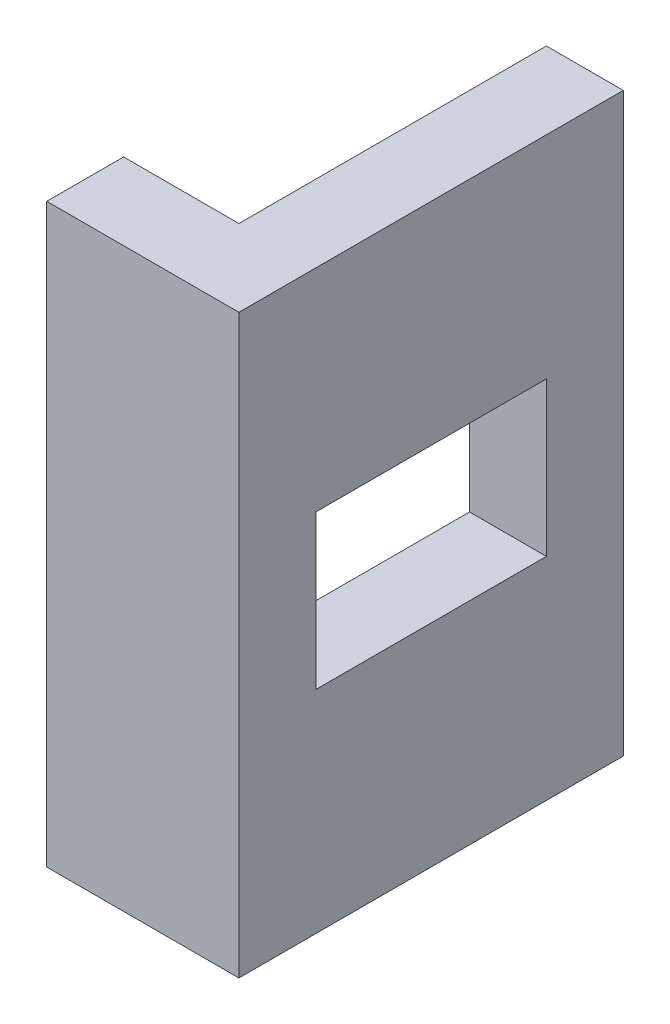
ISO-10303-21;
HEADER;
FILE_DESCRIPTION(('STEP AP214'),'2;1');
FILE_NAME('part.step','',(''),(''),'','','');
FILE_SCHEMA(('AUTOMOTIVE_DESIGN { 1 0 10303 214 1 1 1 1 }'));
ENDSEC;
DATA;
#1=APPLICATION_CONTEXT('core data for automotive mechanical design processes');
#2=APPLICATION_PROTOCOL_DEFINITION('international standard','automotive_design',2000,#1);
#3=PRODUCT_CONTEXT('',#1,'mechanical');
#4=PRODUCT('Part','Part','',(#3));
#5=PRODUCT_RELATED_PRODUCT_CATEGORY('part','',(#4));
#6=PRODUCT_DEFINITION_FORMATION('','',#4);
#7=PRODUCT_DEFINITION_CONTEXT('part definition',#1,'design');
#8=PRODUCT_DEFINITION('design','',#6,#7);
#9=PRODUCT_DEFINITION_SHAPE('','',#8);
#10=(LENGTH_UNIT() NAMED_UNIT(*) SI_UNIT(.MILLI.,.METRE.));
#11=(NAMED_UNIT(*) PLANE_ANGLE_UNIT() SI_UNIT($,.RADIAN.));
#12=(NAMED_UNIT(*) SI_UNIT($,.STERADIAN.) SOLID_ANGLE_UNIT());
#13=UNCERTAINTY_MEASURE_WITH_UNIT(LENGTH_MEASURE(1.E-05),#10,'distance_accuracy_value','');
#14=(GEOMETRIC_REPRESENTATION_CONTEXT(3) GLOBAL_UNCERTAINTY_ASSIGNED_CONTEXT((#13)) GLOBAL_UNIT_ASSIGNED_CONTEXT((#10,
#11,#12)) REPRESENTATION_CONTEXT('',''));
#15=CARTESIAN_POINT('',(0.,0.,0.));
#16=DIRECTION('',(0.,0.,1.));
#17=DIRECTION('',(1.,0.,0.));
#18=AXIS2_PLACEMENT_3D('',#15,#16,#17);
#19=CARTESIAN_POINT('',(2.5,-7.5,5.));
#20=DIRECTION('',(-1.,0.,0.));
#21=DIRECTION('',(0.,0.,1.));
#22=AXIS2_PLACEMENT_3D('',#19,#20,#21);
#23=PLANE('',#22);
#24=DIRECTION('',(0.,1.,0.));
#25=VECTOR('',#24,1.);
#26=CARTESIAN_POINT('',(2.5,-7.5,-5.));
#27=LINE('',#26,#25);
#28=CARTESIAN_POINT('',(2.5,-7.5,-5.));
#29=VERTEX_POINT('',#28);
#30=CARTESIAN_POINT('',(2.5,7.5,-5.));
#31=VERTEX_POINT('',#30);
#32=EDGE_CURVE('E144',#29,#31,#27,.T.);
#33=ORIENTED_EDGE('',*,*,#32,.T.);
#34=DIRECTION('',(0.,0.,-1.));
#35=VECTOR('',#34,1.);
#36=CARTESIAN_POINT('',(2.5,7.5,5.));
#37=LINE('',#36,#35);
#38=CARTESIAN_POINT('',(2.5,7.5,5.));
#39=VERTEX_POINT('',#38);
#40=EDGE_CURVE('E11',#39,#31,#37,.T.);
#41=ORIENTED_EDGE('',*,*,#40,.F.);
#42=DIRECTION('',(0.,1.,0.));
#43=VECTOR('',#42,1.);
#44=CARTESIAN_POINT('',(2.5,-7.5,5.));
#45=LINE('',#44,#43);
#46=CARTESIAN_POINT('',(2.5,-7.5,5.));
#47=VERTEX_POINT('',#46);
#48=EDGE_CURVE('E146',#47,#39,#45,.T.);
#49=ORIENTED_EDGE('',*,*,#48,.F.);
#50=DIRECTION('',(0.,0.,-1.));
#51=VECTOR('',#50,1.);
#52=CARTESIAN_POINT('',(2.5,-7.5,5.));
#53=LINE('',#52,#51);
#54=EDGE_CURVE('E156',#47,#29,#53,.T.);
#55=ORIENTED_EDGE('',*,*,#54,.T.);
#56=EDGE_LOOP('',(#33,#41,#49,#55));
#57=FACE_BOUND('',#56,.T.);
#58=DIRECTION('',(0.,-1.,0.));
#59=VECTOR('',#58,1.);
#60=CARTESIAN_POINT('',(2.5,-2.,-3.));
#61=LINE('',#60,#59);
#62=CARTESIAN_POINT('',(2.5,2.,-3.));
#63=VERTEX_POINT('',#62);
#64=CARTESIAN_POINT('',(2.5,-2.,-3.));
#65=VERTEX_POINT('',#64);
#66=EDGE_CURVE('E118',#63,#65,#61,.T.);
#67=ORIENTED_EDGE('',*,*,#66,.T.);
#68=DIRECTION('',(0.,0.,-1.));
#69=VECTOR('',#68,1.);
#70=CARTESIAN_POINT('',(2.5,-2.,-3.));
#71=LINE('',#70,#69);
#72=CARTESIAN_POINT('',(2.5,-2.,3.));
#73=VERTEX_POINT('',#72);
#74=EDGE_CURVE('E182',#73,#65,#71,.T.);
#75=ORIENTED_EDGE('',*,*,#74,.F.);
#76=DIRECTION('',(0.,-1.,0.));
#77=VECTOR('',#76,1.);
#78=CARTESIAN_POINT('',(2.5,-2.,3.));
#79=LINE('',#78,#77);
#80=CARTESIAN_POINT('',(2.5,2.,3.));
#81=VERTEX_POINT('',#80);
#82=EDGE_CURVE('E177',#81,#73,#79,.T.);
#83=ORIENTED_EDGE('',*,*,#82,.F.);
#84=DIRECTION('',(0.,0.,-1.));
#85=VECTOR('',#84,1.);
#86=CARTESIAN_POINT('',(2.5,2.,-3.));
#87=LINE('',#86,#85);
#88=EDGE_CURVE('E114',#81,#63,#87,.T.);
#89=ORIENTED_EDGE('',*,*,#88,.T.);
#90=EDGE_LOOP('',(#67,#75,#83,#89));
#91=FACE_BOUND('',#90,.T.);
#92=ADVANCED_FACE('F33',(#57,#91),#23,.F.);
#93=CARTESIAN_POINT('',(-2.5,7.5,5.));
#94=DIRECTION('',(0.,-1.,0.));
#95=DIRECTION('',(0.,0.,-1.));
#96=AXIS2_PLACEMENT_3D('',#93,#94,#95);
#97=PLANE('',#96);
#98=DIRECTION('',(-1.,0.,0.));
#99=VECTOR('',#98,1.);
#100=CARTESIAN_POINT('',(-2.5,7.5,-5.));
#101=LINE('',#100,#99);
#102=CARTESIAN_POINT('',(0.500000000000002,7.5,-5.));
#103=VERTEX_POINT('',#102);
#104=EDGE_CURVE('E159',#31,#103,#101,.T.);
#105=ORIENTED_EDGE('',*,*,#104,.T.);
#106=DIRECTION('',(0.,0.,-1.));
#107=VECTOR('',#106,1.);
#108=CARTESIAN_POINT('',(0.500000000000001,7.5,-5.));
#109=LINE('',#108,#107);
#110=CARTESIAN_POINT('',(0.500000000000002,7.5,3.));
#111=VERTEX_POINT('',#110);
#112=EDGE_CURVE('E137',#111,#103,#109,.T.);
#113=ORIENTED_EDGE('',*,*,#112,.F.);
#114=DIRECTION('',(1.,0.,0.));
#115=VECTOR('',#114,1.);
#116=CARTESIAN_POINT('',(-2.5,7.5,3.));
#117=LINE('',#116,#115);
#118=CARTESIAN_POINT('',(-2.5,7.5,3.));
#119=VERTEX_POINT('',#118);
#120=EDGE_CURVE('E131',#119,#111,#117,.T.);
#121=ORIENTED_EDGE('',*,*,#120,.F.);
#122=DIRECTION('',(0.,0.,-1.));
#123=VECTOR('',#122,1.);
#124=CARTESIAN_POINT('',(-2.5,7.5,5.));
#125=LINE('',#124,#123);
#126=CARTESIAN_POINT('',(-2.5,7.5,5.));
#127=VERTEX_POINT('',#126);
#128=EDGE_CURVE('E40',#127,#119,#125,.T.);
#129=ORIENTED_EDGE('',*,*,#128,.F.);
#130=DIRECTION('',(-1.,0.,0.));
#131=VECTOR('',#130,1.);
#132=CARTESIAN_POINT('',(-2.5,7.5,5.));
#133=LINE('',#132,#131);
#134=EDGE_CURVE('E149',#39,#127,#133,.T.);
#135=ORIENTED_EDGE('',*,*,#134,.F.);
#136=ORIENTED_EDGE('',*,*,#40,.T.);
#137=EDGE_LOOP('',(#105,#113,#121,#129,#135,#136));
#138=FACE_BOUND('',#137,.T.);
#139=ADVANCED_FACE('F175',(#138),#97,.F.);
#140=CARTESIAN_POINT('',(-2.5,-7.5,5.));
#141=DIRECTION('',(1.,0.,0.));
#142=DIRECTION('',(0.,0.,-1.));
#143=AXIS2_PLACEMENT_3D('',#140,#141,#142);
#144=PLANE('',#143);
#145=ORIENTED_EDGE('',*,*,#128,.T.);
#146=DIRECTION('',(0.,1.,0.));
#147=VECTOR('',#146,1.);
#148=CARTESIAN_POINT('',(-2.5,-16.0440037453175,3.));
#149=LINE('',#148,#147);
#150=CARTESIAN_POINT('',(-2.5,-7.5,3.));
#151=VERTEX_POINT('',#150);
#152=EDGE_CURVE('E134',#151,#119,#149,.T.);
#153=ORIENTED_EDGE('',*,*,#152,.F.);
#154=DIRECTION('',(0.,0.,-1.));
#155=VECTOR('',#154,1.);
#156=CARTESIAN_POINT('',(-2.5,-7.5,5.));
#157=LINE('',#156,#155);
#158=CARTESIAN_POINT('',(-2.5,-7.5,5.));
#159=VERTEX_POINT('',#158);
#160=EDGE_CURVE('E165',#159,#151,#157,.T.);
#161=ORIENTED_EDGE('',*,*,#160,.F.);
#162=DIRECTION('',(0.,-1.,0.));
#163=VECTOR('',#162,1.);
#164=CARTESIAN_POINT('',(-2.5,-7.5,5.));
#165=LINE('',#164,#163);
#166=EDGE_CURVE('E152',#127,#159,#165,.T.);
#167=ORIENTED_EDGE('',*,*,#166,.F.);
#168=EDGE_LOOP('',(#145,#153,#161,#167));
#169=FACE_BOUND('',#168,.T.);
#170=ADVANCED_FACE('F172',(#169),#144,.F.);
#171=CARTESIAN_POINT('',(-2.5,-7.5,5.));
#172=DIRECTION('',(0.,1.,0.));
#173=DIRECTION('',(0.,0.,1.));
#174=AXIS2_PLACEMENT_3D('',#171,#172,#173);
#175=PLANE('',#174);
#176=DIRECTION('',(-1.,0.,0.));
#177=VECTOR('',#176,1.);
#178=CARTESIAN_POINT('',(-2.5,-7.5,3.));
#179=LINE('',#178,#177);
#180=CARTESIAN_POINT('',(0.500000000000002,-7.5,3.));
#181=VERTEX_POINT('',#180);
#182=EDGE_CURVE('E142',#181,#151,#179,.T.);
#183=ORIENTED_EDGE('',*,*,#182,.F.);
#184=DIRECTION('',(0.,0.,1.));
#185=VECTOR('',#184,1.);
#186=CARTESIAN_POINT('',(0.500000000000001,-7.5,-5.));
#187=LINE('',#186,#185);
#188=CARTESIAN_POINT('',(0.500000000000001,-7.5,-5.));
#189=VERTEX_POINT('',#188);
#190=EDGE_CURVE('E145',#189,#181,#187,.T.);
#191=ORIENTED_EDGE('',*,*,#190,.F.);
#192=DIRECTION('',(1.,0.,0.));
#193=VECTOR('',#192,1.);
#194=CARTESIAN_POINT('',(-2.5,-7.5,-5.));
#195=LINE('',#194,#193);
#196=EDGE_CURVE('E150',#189,#29,#195,.T.);
#197=ORIENTED_EDGE('',*,*,#196,.T.);
#198=ORIENTED_EDGE('',*,*,#54,.F.);
#199=DIRECTION('',(1.,0.,0.));
#200=VECTOR('',#199,1.);
#201=CARTESIAN_POINT('',(-2.5,-7.5,5.));
#202=LINE('',#201,#200);
#203=EDGE_CURVE('E154',#159,#47,#202,.T.);
#204=ORIENTED_EDGE('',*,*,#203,.F.);
#205=ORIENTED_EDGE('',*,*,#160,.T.);
#206=EDGE_LOOP('',(#183,#191,#197,#198,#204,#205));
#207=FACE_BOUND('',#206,.T.);
#208=ADVANCED_FACE('F203',(#207),#175,.F.);
#209=CARTESIAN_POINT('',(0.,0.,5.));
#210=DIRECTION('',(0.,0.,-1.));
#211=DIRECTION('',(-1.,0.,0.));
#212=AXIS2_PLACEMENT_3D('',#209,#210,#211);
#213=PLANE('',#212);
#214=ORIENTED_EDGE('',*,*,#48,.T.);
#215=ORIENTED_EDGE('',*,*,#134,.T.);
#216=ORIENTED_EDGE('',*,*,#166,.T.);
#217=ORIENTED_EDGE('',*,*,#203,.T.);
#218=EDGE_LOOP('',(#214,#215,#216,#217));
#219=FACE_BOUND('',#218,.T.);
#220=ADVANCED_FACE('F213',(#219),#213,.F.);
#221=CARTESIAN_POINT('',(0.,0.,-5.));
#222=DIRECTION('',(0.,0.,-1.));
#223=DIRECTION('',(-1.,0.,0.));
#224=AXIS2_PLACEMENT_3D('',#221,#222,#223);
#225=PLANE('',#224);
#226=DIRECTION('',(0.,1.,0.));
#227=VECTOR('',#226,1.);
#228=CARTESIAN_POINT('',(0.500000000000001,-16.0440037453175,-5.));
#229=LINE('',#228,#227);
#230=EDGE_CURVE('E136',#189,#103,#229,.T.);
#231=ORIENTED_EDGE('',*,*,#230,.T.);
#232=ORIENTED_EDGE('',*,*,#104,.F.);
#233=ORIENTED_EDGE('',*,*,#32,.F.);
#234=ORIENTED_EDGE('',*,*,#196,.F.);
#235=EDGE_LOOP('',(#231,#232,#233,#234));
#236=FACE_BOUND('',#235,.T.);
#237=ADVANCED_FACE('F207',(#236),#225,.T.);
#238=CARTESIAN_POINT('',(0.500000000000001,-16.0440037453175,-5.));
#239=DIRECTION('',(1.,0.,0.));
#240=DIRECTION('',(0.,0.,-1.));
#241=AXIS2_PLACEMENT_3D('',#238,#239,#240);
#242=PLANE('',#241);
#243=DIRECTION('',(0.,1.,0.));
#244=VECTOR('',#243,1.);
#245=CARTESIAN_POINT('',(0.500000000000002,-16.0440037453175,3.));
#246=LINE('',#245,#244);
#247=CARTESIAN_POINT('',(0.500000000000002,-2.,3.));
#248=VERTEX_POINT('',#247);
#249=EDGE_CURVE('E133',#181,#248,#246,.T.);
#250=ORIENTED_EDGE('',*,*,#249,.T.);
#251=DIRECTION('',(0.,0.,1.));
#252=VECTOR('',#251,1.);
#253=CARTESIAN_POINT('',(0.500000000000001,-2.,-3.));
#254=LINE('',#253,#252);
#255=CARTESIAN_POINT('',(0.500000000000001,-2.,-3.));
#256=VERTEX_POINT('',#255);
#257=EDGE_CURVE('E55',#256,#248,#254,.T.);
#258=ORIENTED_EDGE('',*,*,#257,.F.);
#259=DIRECTION('',(0.,1.,0.));
#260=VECTOR('',#259,1.);
#261=CARTESIAN_POINT('',(0.500000000000001,-2.,-3.));
#262=LINE('',#261,#260);
#263=CARTESIAN_POINT('',(0.500000000000001,2.,-3.));
#264=VERTEX_POINT('',#263);
#265=EDGE_CURVE('E127',#256,#264,#262,.T.);
#266=ORIENTED_EDGE('',*,*,#265,.T.);
#267=DIRECTION('',(0.,0.,1.));
#268=VECTOR('',#267,1.);
#269=CARTESIAN_POINT('',(0.500000000000001,2.,-3.));
#270=LINE('',#269,#268);
#271=CARTESIAN_POINT('',(0.500000000000002,2.,3.));
#272=VERTEX_POINT('',#271);
#273=EDGE_CURVE('E111',#264,#272,#270,.T.);
#274=ORIENTED_EDGE('',*,*,#273,.T.);
#275=EDGE_CURVE('E124',#272,#111,#246,.T.);
#276=ORIENTED_EDGE('',*,*,#275,.T.);
#277=ORIENTED_EDGE('',*,*,#112,.T.);
#278=ORIENTED_EDGE('',*,*,#230,.F.);
#279=ORIENTED_EDGE('',*,*,#190,.T.);
#280=EDGE_LOOP('',(#250,#258,#266,#274,#276,#277,#278,#279));
#281=FACE_BOUND('',#280,.T.);
#282=ADVANCED_FACE('F123',(#281),#242,.F.);
#283=CARTESIAN_POINT('',(-2.5,-16.0440037453175,3.));
#284=DIRECTION('',(0.,0.,1.));
#285=DIRECTION('',(1.,0.,0.));
#286=AXIS2_PLACEMENT_3D('',#283,#284,#285);
#287=PLANE('',#286);
#288=ORIENTED_EDGE('',*,*,#182,.T.);
#289=ORIENTED_EDGE('',*,*,#152,.T.);
#290=ORIENTED_EDGE('',*,*,#120,.T.);
#291=ORIENTED_EDGE('',*,*,#275,.F.);
#292=DIRECTION('',(-1.,0.,0.));
#293=VECTOR('',#292,1.);
#294=CARTESIAN_POINT('',(9.71110255092798,2.,3.));
#295=LINE('',#294,#293);
#296=EDGE_CURVE('E108',#81,#272,#295,.T.);
#297=ORIENTED_EDGE('',*,*,#296,.F.);
#298=ORIENTED_EDGE('',*,*,#82,.T.);
#299=DIRECTION('',(-1.,0.,0.));
#300=VECTOR('',#299,1.);
#301=CARTESIAN_POINT('',(9.71110255092798,-2.,3.));
#302=LINE('',#301,#300);
#303=EDGE_CURVE('E119',#73,#248,#302,.T.);
#304=ORIENTED_EDGE('',*,*,#303,.T.);
#305=ORIENTED_EDGE('',*,*,#249,.F.);
#306=EDGE_LOOP('',(#288,#289,#290,#291,#297,#298,#304,#305));
#307=FACE_BOUND('',#306,.T.);
#308=ADVANCED_FACE('F129',(#307),#287,.F.);
#309=CARTESIAN_POINT('',(9.71110255092798,-2.,-3.));
#310=DIRECTION('',(0.,0.,1.));
#311=DIRECTION('',(1.,0.,0.));
#312=AXIS2_PLACEMENT_3D('',#309,#310,#311);
#313=PLANE('',#312);
#314=DIRECTION('',(-1.,0.,0.));
#315=VECTOR('',#314,1.);
#316=CARTESIAN_POINT('',(9.71110255092798,2.,-3.));
#317=LINE('',#316,#315);
#318=EDGE_CURVE('E47',#63,#264,#317,.T.);
#319=ORIENTED_EDGE('',*,*,#318,.T.);
#320=ORIENTED_EDGE('',*,*,#265,.F.);
#321=DIRECTION('',(-1.,0.,0.));
#322=VECTOR('',#321,1.);
#323=CARTESIAN_POINT('',(9.71110255092798,-2.,-3.));
#324=LINE('',#323,#322);
#325=EDGE_CURVE('E185',#65,#256,#324,.T.);
#326=ORIENTED_EDGE('',*,*,#325,.F.);
#327=ORIENTED_EDGE('',*,*,#66,.F.);
#328=EDGE_LOOP('',(#319,#320,#326,#327));
#329=FACE_BOUND('',#328,.T.);
#330=ADVANCED_FACE('F196',(#329),#313,.T.);
#331=CARTESIAN_POINT('',(9.71110255092798,-2.,-3.));
#332=DIRECTION('',(0.,-1.,0.));
#333=DIRECTION('',(0.,0.,-1.));
#334=AXIS2_PLACEMENT_3D('',#331,#332,#333);
#335=PLANE('',#334);
#336=ORIENTED_EDGE('',*,*,#74,.T.);
#337=ORIENTED_EDGE('',*,*,#325,.T.);
#338=ORIENTED_EDGE('',*,*,#257,.T.);
#339=ORIENTED_EDGE('',*,*,#303,.F.);
#340=EDGE_LOOP('',(#336,#337,#338,#339));
#341=FACE_BOUND('',#340,.T.);
#342=ADVANCED_FACE('F193',(#341),#335,.F.);
#343=CARTESIAN_POINT('',(9.71110255092798,2.,-3.));
#344=DIRECTION('',(0.,-1.,0.));
#345=DIRECTION('',(0.,0.,-1.));
#346=AXIS2_PLACEMENT_3D('',#343,#344,#345);
#347=PLANE('',#346);
#348=ORIENTED_EDGE('',*,*,#296,.T.);
#349=ORIENTED_EDGE('',*,*,#273,.F.);
#350=ORIENTED_EDGE('',*,*,#318,.F.);
#351=ORIENTED_EDGE('',*,*,#88,.F.);
#352=EDGE_LOOP('',(#348,#349,#350,#351));
#353=FACE_BOUND('',#352,.T.);
#354=ADVANCED_FACE('F110',(#353),#347,.T.);
#355=CLOSED_SHELL('',(#92,#139,#170,#208,#220,#237,#282,#308,#330,#342,#354));
#356=MANIFOLD_SOLID_BREP('B2',#355);
#357=ADVANCED_BREP_SHAPE_REPRESENTATION('',(#18,#356),#14);
#358=SHAPE_DEFINITION_REPRESENTATION(#9,#357);
ENDSEC;
END-ISO-10303-21;
